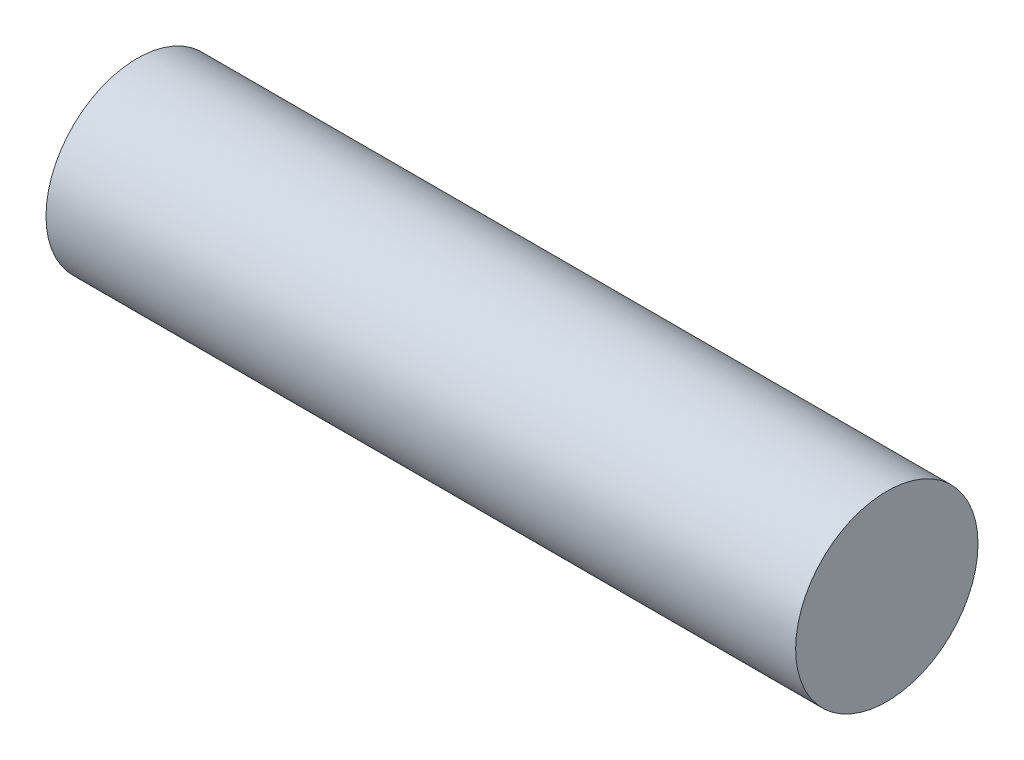
ISO-10303-21;
HEADER;
FILE_DESCRIPTION(('STEP AP214'),'2;1');
FILE_NAME('part.step','',(''),(''),'','','');
FILE_SCHEMA(('AUTOMOTIVE_DESIGN { 1 0 10303 214 1 1 1 1 }'));
ENDSEC;
DATA;
#1=APPLICATION_CONTEXT('core data for automotive mechanical design processes');
#2=APPLICATION_PROTOCOL_DEFINITION('international standard','automotive_design',2000,#1);
#3=PRODUCT_CONTEXT('',#1,'mechanical');
#4=PRODUCT('Part','Part','',(#3));
#5=PRODUCT_RELATED_PRODUCT_CATEGORY('part','',(#4));
#6=PRODUCT_DEFINITION_FORMATION('','',#4);
#7=PRODUCT_DEFINITION_CONTEXT('part definition',#1,'design');
#8=PRODUCT_DEFINITION('design','',#6,#7);
#9=PRODUCT_DEFINITION_SHAPE('','',#8);
#10=(LENGTH_UNIT() NAMED_UNIT(*) SI_UNIT(.MILLI.,.METRE.));
#11=(NAMED_UNIT(*) PLANE_ANGLE_UNIT() SI_UNIT($,.RADIAN.));
#12=(NAMED_UNIT(*) SI_UNIT($,.STERADIAN.) SOLID_ANGLE_UNIT());
#13=UNCERTAINTY_MEASURE_WITH_UNIT(LENGTH_MEASURE(1.E-05),#10,'distance_accuracy_value','');
#14=(GEOMETRIC_REPRESENTATION_CONTEXT(3) GLOBAL_UNCERTAINTY_ASSIGNED_CONTEXT((#13)) GLOBAL_UNIT_ASSIGNED_CONTEXT((#10,
#11,#12)) REPRESENTATION_CONTEXT('',''));
#15=CARTESIAN_POINT('',(0.,0.,0.));
#16=DIRECTION('',(0.,0.,1.));
#17=DIRECTION('',(1.,0.,0.));
#18=AXIS2_PLACEMENT_3D('',#15,#16,#17);
#19=CARTESIAN_POINT('',(740.,0.,0.));
#20=DIRECTION('',(-1.,0.,0.));
#21=DIRECTION('',(0.,0.,1.));
#22=AXIS2_PLACEMENT_3D('',#19,#20,#21);
#23=CYLINDRICAL_SURFACE('',#22,90.);
#24=CARTESIAN_POINT('',(740.,0.,0.));
#25=DIRECTION('',(1.,0.,0.));
#26=DIRECTION('',(0.,0.,-1.));
#27=AXIS2_PLACEMENT_3D('',#24,#25,#26);
#28=CIRCLE('',#27,90.);
#29=CARTESIAN_POINT('',(740.,0.,-90.));
#30=VERTEX_POINT('',#29);
#31=EDGE_CURVE('E10',#30,#30,#28,.T.);
#32=ORIENTED_EDGE('',*,*,#31,.F.);
#33=EDGE_LOOP('',(#32));
#34=FACE_BOUND('',#33,.T.);
#35=CARTESIAN_POINT('',(0.,0.,0.));
#36=DIRECTION('',(1.,0.,0.));
#37=DIRECTION('',(0.,0.,-1.));
#38=AXIS2_PLACEMENT_3D('',#35,#36,#37);
#39=CIRCLE('',#38,90.);
#40=CARTESIAN_POINT('',(0.,0.,-90.));
#41=VERTEX_POINT('',#40);
#42=EDGE_CURVE('E37',#41,#41,#39,.T.);
#43=ORIENTED_EDGE('',*,*,#42,.T.);
#44=EDGE_LOOP('',(#43));
#45=FACE_BOUND('',#44,.T.);
#46=ADVANCED_FACE('F40',(#34,#45),#23,.T.);
#47=CARTESIAN_POINT('',(740.,0.,0.));
#48=DIRECTION('',(1.,0.,0.));
#49=DIRECTION('',(0.,0.,-1.));
#50=AXIS2_PLACEMENT_3D('',#47,#48,#49);
#51=PLANE('',#50);
#52=ORIENTED_EDGE('',*,*,#31,.T.);
#53=EDGE_LOOP('',(#52));
#54=FACE_BOUND('',#53,.T.);
#55=ADVANCED_FACE('F55',(#54),#51,.T.);
#56=CARTESIAN_POINT('',(0.,0.,0.));
#57=DIRECTION('',(1.,0.,0.));
#58=DIRECTION('',(0.,0.,-1.));
#59=AXIS2_PLACEMENT_3D('',#56,#57,#58);
#60=PLANE('',#59);
#61=ORIENTED_EDGE('',*,*,#42,.F.);
#62=EDGE_LOOP('',(#61));
#63=FACE_BOUND('',#62,.T.);
#64=ADVANCED_FACE('F49',(#63),#60,.F.);
#65=CLOSED_SHELL('',(#46,#55,#64));
#66=MANIFOLD_SOLID_BREP('B2',#65);
#67=ADVANCED_BREP_SHAPE_REPRESENTATION('',(#18,#66),#14);
#68=SHAPE_DEFINITION_REPRESENTATION(#9,#67);
ENDSEC;
END-ISO-10303-21;
